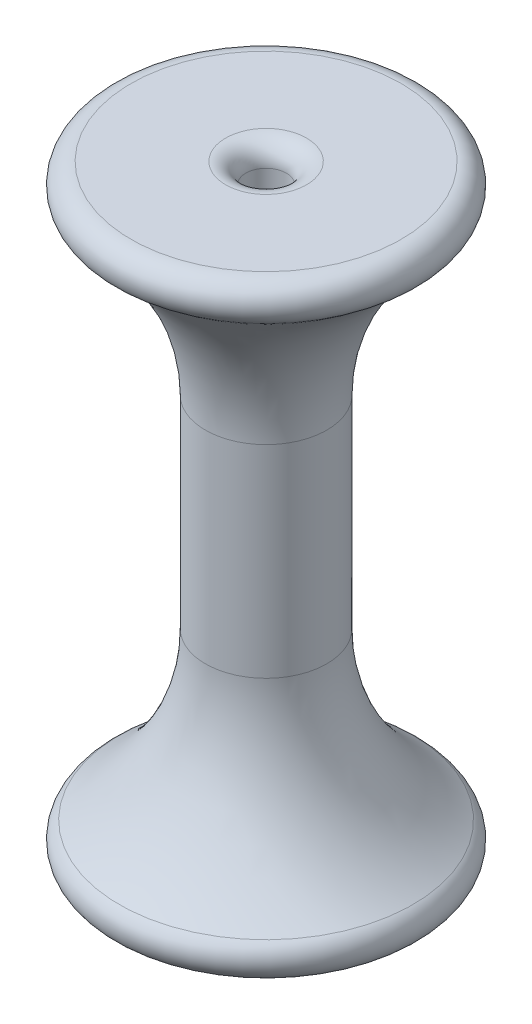
ISO-10303-21;
HEADER;
FILE_DESCRIPTION(('STEP AP214'),'2;1');
FILE_NAME('part.step','',(''),(''),'','','');
FILE_SCHEMA(('AUTOMOTIVE_DESIGN { 1 0 10303 214 1 1 1 1 }'));
ENDSEC;
DATA;
#1=APPLICATION_CONTEXT('core data for automotive mechanical design processes');
#2=APPLICATION_PROTOCOL_DEFINITION('international standard','automotive_design',2000,#1);
#3=PRODUCT_CONTEXT('',#1,'mechanical');
#4=PRODUCT('Part','Part','',(#3));
#5=PRODUCT_RELATED_PRODUCT_CATEGORY('part','',(#4));
#6=PRODUCT_DEFINITION_FORMATION('','',#4);
#7=PRODUCT_DEFINITION_CONTEXT('part definition',#1,'design');
#8=PRODUCT_DEFINITION('design','',#6,#7);
#9=PRODUCT_DEFINITION_SHAPE('','',#8);
#10=(LENGTH_UNIT() NAMED_UNIT(*) SI_UNIT(.MILLI.,.METRE.));
#11=(NAMED_UNIT(*) PLANE_ANGLE_UNIT() SI_UNIT($,.RADIAN.));
#12=(NAMED_UNIT(*) SI_UNIT($,.STERADIAN.) SOLID_ANGLE_UNIT());
#13=UNCERTAINTY_MEASURE_WITH_UNIT(LENGTH_MEASURE(1.E-05),#10,'distance_accuracy_value','');
#14=(GEOMETRIC_REPRESENTATION_CONTEXT(3) GLOBAL_UNCERTAINTY_ASSIGNED_CONTEXT((#13)) GLOBAL_UNIT_ASSIGNED_CONTEXT((#10,
#11,#12)) REPRESENTATION_CONTEXT('',''));
#15=CARTESIAN_POINT('',(0.,0.,0.));
#16=DIRECTION('',(0.,0.,1.));
#17=DIRECTION('',(1.,0.,0.));
#18=AXIS2_PLACEMENT_3D('',#15,#16,#17);
#19=CARTESIAN_POINT('',(0.,5.,0.));
#20=DIRECTION('',(0.,-1.,0.));
#21=DIRECTION('',(0.,0.,-1.));
#22=AXIS2_PLACEMENT_3D('',#19,#20,#21);
#23=TOROIDAL_SURFACE('',#22,13.,10.);
#24=CARTESIAN_POINT('',(0.,5.,0.));
#25=DIRECTION('',(0.,-1.,0.));
#26=DIRECTION('',(0.,0.,-1.));
#27=AXIS2_PLACEMENT_3D('',#24,#25,#26);
#28=CIRCLE('',#27,3.);
#29=CARTESIAN_POINT('',(0.,5.,-3.));
#30=VERTEX_POINT('',#29);
#31=EDGE_CURVE('E10',#30,#30,#28,.T.);
#32=ORIENTED_EDGE('',*,*,#31,.F.);
#33=EDGE_LOOP('',(#32));
#34=FACE_BOUND('',#33,.T.);
#35=CARTESIAN_POINT('',(0.,13.1818181818182,0.));
#36=DIRECTION('',(0.,-1.,0.));
#37=DIRECTION('',(0.,0.,-1.));
#38=AXIS2_PLACEMENT_3D('',#35,#36,#37);
#39=CIRCLE('',#38,7.25040425423931);
#40=CARTESIAN_POINT('',(0.,13.1818181818182,-7.25040425423931));
#41=VERTEX_POINT('',#40);
#42=EDGE_CURVE('E86',#41,#41,#39,.T.);
#43=ORIENTED_EDGE('',*,*,#42,.T.);
#44=EDGE_LOOP('',(#43));
#45=FACE_BOUND('',#44,.T.);
#46=ADVANCED_FACE('F43',(#34,#45),#23,.F.);
#47=CARTESIAN_POINT('',(0.,0.,0.));
#48=DIRECTION('',(0.,-1.,0.));
#49=DIRECTION('',(0.,0.,-1.));
#50=AXIS2_PLACEMENT_3D('',#47,#48,#49);
#51=CYLINDRICAL_SURFACE('',#50,3.);
#52=CARTESIAN_POINT('',(0.,-5.,0.));
#53=DIRECTION('',(0.,-1.,0.));
#54=DIRECTION('',(0.,0.,-1.));
#55=AXIS2_PLACEMENT_3D('',#52,#53,#54);
#56=CIRCLE('',#55,3.);
#57=CARTESIAN_POINT('',(0.,-5.,-3.));
#58=VERTEX_POINT('',#57);
#59=EDGE_CURVE('E50',#58,#58,#56,.T.);
#60=ORIENTED_EDGE('',*,*,#59,.F.);
#61=EDGE_LOOP('',(#60));
#62=FACE_BOUND('',#61,.T.);
#63=ORIENTED_EDGE('',*,*,#31,.T.);
#64=EDGE_LOOP('',(#63));
#65=FACE_BOUND('',#64,.T.);
#66=ADVANCED_FACE('F136',(#62,#65),#51,.T.);
#67=CARTESIAN_POINT('',(0.,-5.,0.));
#68=DIRECTION('',(0.,-1.,0.));
#69=DIRECTION('',(0.,0.,-1.));
#70=AXIS2_PLACEMENT_3D('',#67,#68,#69);
#71=TOROIDAL_SURFACE('',#70,13.,10.);
#72=CARTESIAN_POINT('',(0.,-13.1818181818182,0.));
#73=DIRECTION('',(0.,-1.,0.));
#74=DIRECTION('',(0.,0.,-1.));
#75=AXIS2_PLACEMENT_3D('',#72,#73,#74);
#76=CIRCLE('',#75,7.25040425423929);
#77=CARTESIAN_POINT('',(0.,-13.1818181818182,-7.25040425423929));
#78=VERTEX_POINT('',#77);
#79=EDGE_CURVE('E55',#78,#78,#76,.T.);
#80=ORIENTED_EDGE('',*,*,#79,.F.);
#81=EDGE_LOOP('',(#80));
#82=FACE_BOUND('',#81,.T.);
#83=ORIENTED_EDGE('',*,*,#59,.T.);
#84=EDGE_LOOP('',(#83));
#85=FACE_BOUND('',#84,.T.);
#86=ADVANCED_FACE('F131',(#82,#85),#71,.F.);
#87=CARTESIAN_POINT('',(0.,-14.,0.));
#88=DIRECTION('',(0.,-1.,0.));
#89=DIRECTION('',(0.,0.,-1.));
#90=AXIS2_PLACEMENT_3D('',#87,#88,#89);
#91=TOROIDAL_SURFACE('',#90,6.67544467966322,1.);
#92=CARTESIAN_POINT('',(0.,-15.,0.));
#93=DIRECTION('',(0.,-1.,0.));
#94=DIRECTION('',(0.,0.,-1.));
#95=AXIS2_PLACEMENT_3D('',#92,#93,#94);
#96=CIRCLE('',#95,6.67544467966322);
#97=CARTESIAN_POINT('',(0.,-15.,-6.67544467966322));
#98=VERTEX_POINT('',#97);
#99=EDGE_CURVE('E60',#98,#98,#96,.T.);
#100=ORIENTED_EDGE('',*,*,#99,.F.);
#101=EDGE_LOOP('',(#100));
#102=FACE_BOUND('',#101,.T.);
#103=ORIENTED_EDGE('',*,*,#79,.T.);
#104=EDGE_LOOP('',(#103));
#105=FACE_BOUND('',#104,.T.);
#106=ADVANCED_FACE('F125',(#102,#105),#91,.T.);
#107=CARTESIAN_POINT('',(-6.67544467966322,-15.,0.));
#108=DIRECTION('',(0.,1.,0.));
#109=DIRECTION('',(0.,0.,1.));
#110=AXIS2_PLACEMENT_3D('',#107,#108,#109);
#111=PLANE('',#110);
#112=CARTESIAN_POINT('',(0.,-15.,0.));
#113=DIRECTION('',(0.,-1.,0.));
#114=DIRECTION('',(0.,0.,-1.));
#115=AXIS2_PLACEMENT_3D('',#112,#113,#114);
#116=CIRCLE('',#115,2.);
#117=CARTESIAN_POINT('',(0.,-15.,-2.));
#118=VERTEX_POINT('',#117);
#119=EDGE_CURVE('E66',#118,#118,#116,.T.);
#120=ORIENTED_EDGE('',*,*,#119,.F.);
#121=EDGE_LOOP('',(#120));
#122=FACE_BOUND('',#121,.T.);
#123=ORIENTED_EDGE('',*,*,#99,.T.);
#124=EDGE_LOOP('',(#123));
#125=FACE_BOUND('',#124,.T.);
#126=ADVANCED_FACE('F119',(#122,#125),#111,.F.);
#127=CARTESIAN_POINT('',(0.,-14.,0.));
#128=DIRECTION('',(0.,-1.,0.));
#129=DIRECTION('',(0.,0.,-1.));
#130=AXIS2_PLACEMENT_3D('',#127,#128,#129);
#131=TOROIDAL_SURFACE('',#130,2.,1.);
#132=CARTESIAN_POINT('',(0.,-14.,0.));
#133=DIRECTION('',(0.,-1.,0.));
#134=DIRECTION('',(0.,0.,-1.));
#135=AXIS2_PLACEMENT_3D('',#132,#133,#134);
#136=CIRCLE('',#135,1.);
#137=CARTESIAN_POINT('',(0.,-14.,-1.));
#138=VERTEX_POINT('',#137);
#139=EDGE_CURVE('E70',#138,#138,#136,.T.);
#140=ORIENTED_EDGE('',*,*,#139,.F.);
#141=EDGE_LOOP('',(#140));
#142=FACE_BOUND('',#141,.T.);
#143=ORIENTED_EDGE('',*,*,#119,.T.);
#144=EDGE_LOOP('',(#143));
#145=FACE_BOUND('',#144,.T.);
#146=ADVANCED_FACE('F113',(#142,#145),#131,.T.);
#147=CARTESIAN_POINT('',(0.,0.,0.));
#148=DIRECTION('',(0.,-1.,0.));
#149=DIRECTION('',(0.,0.,-1.));
#150=AXIS2_PLACEMENT_3D('',#147,#148,#149);
#151=CYLINDRICAL_SURFACE('',#150,1.);
#152=CARTESIAN_POINT('',(0.,14.,0.));
#153=DIRECTION('',(0.,-1.,0.));
#154=DIRECTION('',(0.,0.,-1.));
#155=AXIS2_PLACEMENT_3D('',#152,#153,#154);
#156=CIRCLE('',#155,1.);
#157=CARTESIAN_POINT('',(0.,14.,-1.));
#158=VERTEX_POINT('',#157);
#159=EDGE_CURVE('E74',#158,#158,#156,.T.);
#160=ORIENTED_EDGE('',*,*,#159,.F.);
#161=EDGE_LOOP('',(#160));
#162=FACE_BOUND('',#161,.T.);
#163=ORIENTED_EDGE('',*,*,#139,.T.);
#164=EDGE_LOOP('',(#163));
#165=FACE_BOUND('',#164,.T.);
#166=ADVANCED_FACE('F107',(#162,#165),#151,.F.);
#167=CARTESIAN_POINT('',(0.,14.,0.));
#168=DIRECTION('',(0.,-1.,0.));
#169=DIRECTION('',(0.,0.,-1.));
#170=AXIS2_PLACEMENT_3D('',#167,#168,#169);
#171=TOROIDAL_SURFACE('',#170,2.,1.);
#172=CARTESIAN_POINT('',(0.,15.,0.));
#173=DIRECTION('',(0.,-1.,0.));
#174=DIRECTION('',(0.,0.,-1.));
#175=AXIS2_PLACEMENT_3D('',#172,#173,#174);
#176=CIRCLE('',#175,2.);
#177=CARTESIAN_POINT('',(0.,15.,-2.));
#178=VERTEX_POINT('',#177);
#179=EDGE_CURVE('E78',#178,#178,#176,.T.);
#180=ORIENTED_EDGE('',*,*,#179,.F.);
#181=EDGE_LOOP('',(#180));
#182=FACE_BOUND('',#181,.T.);
#183=ORIENTED_EDGE('',*,*,#159,.T.);
#184=EDGE_LOOP('',(#183));
#185=FACE_BOUND('',#184,.T.);
#186=ADVANCED_FACE('F101',(#182,#185),#171,.T.);
#187=CARTESIAN_POINT('',(-6.67544467966324,15.,0.));
#188=DIRECTION('',(0.,-1.,0.));
#189=DIRECTION('',(0.,0.,-1.));
#190=AXIS2_PLACEMENT_3D('',#187,#188,#189);
#191=PLANE('',#190);
#192=CARTESIAN_POINT('',(0.,15.,0.));
#193=DIRECTION('',(0.,-1.,0.));
#194=DIRECTION('',(0.,0.,-1.));
#195=AXIS2_PLACEMENT_3D('',#192,#193,#194);
#196=CIRCLE('',#195,6.67544467966324);
#197=CARTESIAN_POINT('',(0.,15.,-6.67544467966324));
#198=VERTEX_POINT('',#197);
#199=EDGE_CURVE('E82',#198,#198,#196,.T.);
#200=ORIENTED_EDGE('',*,*,#199,.F.);
#201=EDGE_LOOP('',(#200));
#202=FACE_BOUND('',#201,.T.);
#203=ORIENTED_EDGE('',*,*,#179,.T.);
#204=EDGE_LOOP('',(#203));
#205=FACE_BOUND('',#204,.T.);
#206=ADVANCED_FACE('F95',(#202,#205),#191,.F.);
#207=CARTESIAN_POINT('',(0.,14.,0.));
#208=DIRECTION('',(0.,-1.,0.));
#209=DIRECTION('',(0.,0.,-1.));
#210=AXIS2_PLACEMENT_3D('',#207,#208,#209);
#211=TOROIDAL_SURFACE('',#210,6.67544467966324,1.);
#212=ORIENTED_EDGE('',*,*,#42,.F.);
#213=EDGE_LOOP('',(#212));
#214=FACE_BOUND('',#213,.T.);
#215=ORIENTED_EDGE('',*,*,#199,.T.);
#216=EDGE_LOOP('',(#215));
#217=FACE_BOUND('',#216,.T.);
#218=ADVANCED_FACE('F92',(#214,#217),#211,.T.);
#219=CLOSED_SHELL('',(#46,#66,#86,#106,#126,#146,#166,#186,#206,#218));
#220=MANIFOLD_SOLID_BREP('B2',#219);
#221=ADVANCED_BREP_SHAPE_REPRESENTATION('',(#18,#220),#14);
#222=SHAPE_DEFINITION_REPRESENTATION(#9,#221);
ENDSEC;
END-ISO-10303-21;
